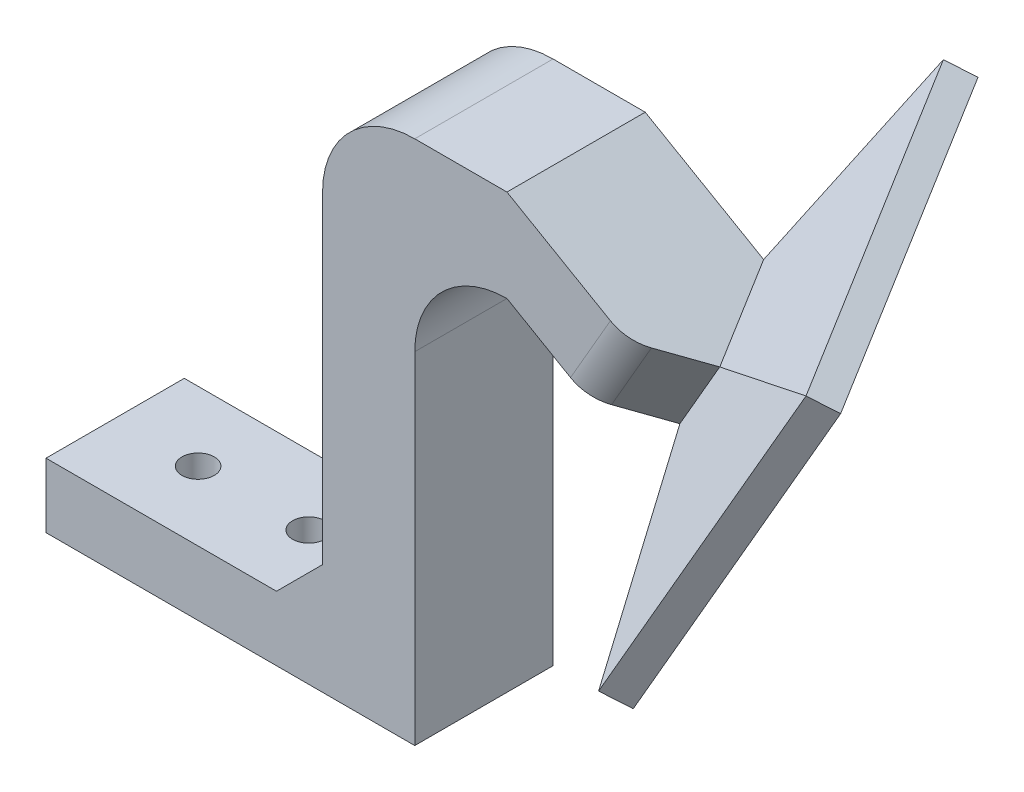
ISO-10303-21;
HEADER;
FILE_DESCRIPTION(('STEP AP214'),'2;1');
FILE_NAME('part.step','',(''),(''),'','','');
FILE_SCHEMA(('AUTOMOTIVE_DESIGN { 1 0 10303 214 1 1 1 1 }'));
ENDSEC;
DATA;
#1=APPLICATION_CONTEXT('core data for automotive mechanical design processes');
#2=APPLICATION_PROTOCOL_DEFINITION('international standard','automotive_design',2000,#1);
#3=PRODUCT_CONTEXT('',#1,'mechanical');
#4=PRODUCT('Part','Part','',(#3));
#5=PRODUCT_RELATED_PRODUCT_CATEGORY('part','',(#4));
#6=PRODUCT_DEFINITION_FORMATION('','',#4);
#7=PRODUCT_DEFINITION_CONTEXT('part definition',#1,'design');
#8=PRODUCT_DEFINITION('design','',#6,#7);
#9=PRODUCT_DEFINITION_SHAPE('','',#8);
#10=(LENGTH_UNIT() NAMED_UNIT(*) SI_UNIT(.MILLI.,.METRE.));
#11=(NAMED_UNIT(*) PLANE_ANGLE_UNIT() SI_UNIT($,.RADIAN.));
#12=(NAMED_UNIT(*) SI_UNIT($,.STERADIAN.) SOLID_ANGLE_UNIT());
#13=UNCERTAINTY_MEASURE_WITH_UNIT(LENGTH_MEASURE(1.E-05),#10,'distance_accuracy_value','');
#14=(GEOMETRIC_REPRESENTATION_CONTEXT(3) GLOBAL_UNCERTAINTY_ASSIGNED_CONTEXT((#13)) GLOBAL_UNIT_ASSIGNED_CONTEXT((#10,
#11,#12)) REPRESENTATION_CONTEXT('',''));
#15=CARTESIAN_POINT('',(0.,0.,0.));
#16=DIRECTION('',(0.,0.,1.));
#17=DIRECTION('',(1.,0.,0.));
#18=AXIS2_PLACEMENT_3D('',#15,#16,#17);
#19=CARTESIAN_POINT('',(2.07514390191196,8.68866645557202,2.5));
#20=DIRECTION('',(-0.499999999999998,-0.86602540378444,0.));
#21=DIRECTION('',(0.86602540378444,-0.499999999999998,0.));
#22=AXIS2_PLACEMENT_3D('',#19,#20,#21);
#23=CYLINDRICAL_SURFACE('',#22,5.);
#24=DIRECTION('',(0.499999999999998,0.86602540378444,0.));
#25=VECTOR('',#24,1.);
#26=CARTESIAN_POINT('',(2.07514390191196,8.68866645557202,7.5));
#27=LINE('',#26,#25);
#28=CARTESIAN_POINT('',(21.8957531153131,43.0189686501509,7.5));
#29=VERTEX_POINT('',#28);
#30=CARTESIAN_POINT('',(26.2257789965232,50.5187934744943,7.49999999999965));
#31=VERTEX_POINT('',#30);
#32=EDGE_CURVE('E334',#29,#31,#27,.T.);
#33=ORIENTED_EDGE('',*,*,#32,.F.);
#34=CARTESIAN_POINT('',(21.8957531153131,43.0189686501508,2.5));
#35=DIRECTION('',(-0.499977999515988,-0.866038105397211,0.));
#36=DIRECTION('',(-0.866038105397211,0.499977999515988,-2.34568710330772E-10));
#37=AXIS2_PLACEMENT_3D('',#34,#35,#36);
#38=ELLIPSE('',#37,5.00000000161338,5.);
#39=CARTESIAN_POINT('',(23.6603810567667,42.0002200032269,7.06598723446655));
#40=VERTEX_POINT('',#39);
#41=EDGE_CURVE('E50',#40,#29,#38,.T.);
#42=ORIENTED_EDGE('',*,*,#41,.F.);
#43=CARTESIAN_POINT('',(21.8957789965229,43.0190134777212,2.5));
#44=DIRECTION('',(0.499999999999997,0.86602540378444,0.));
#45=DIRECTION('',(-0.86602540378444,0.499999999999997,0.));
#46=AXIS2_PLACEMENT_3D('',#43,#44,#45);
#47=CIRCLE('',#46,5.);
#48=CARTESIAN_POINT('',(24.9223578813942,41.2716173438171,6.07581137713784));
#49=VERTEX_POINT('',#48);
#50=EDGE_CURVE('E60',#49,#40,#47,.F.);
#51=ORIENTED_EDGE('',*,*,#50,.F.);
#52=DIRECTION('',(0.499999999999998,0.86602540378444,0.));
#53=VECTOR('',#52,1.);
#54=CARTESIAN_POINT('',(5.10172278678324,6.94127032166796,6.07581137713784));
#55=LINE('',#54,#53);
#56=CARTESIAN_POINT('',(29.2523578813942,48.7713973405903,6.07581137713784));
#57=VERTEX_POINT('',#56);
#58=EDGE_CURVE('E337',#57,#49,#55,.F.);
#59=ORIENTED_EDGE('',*,*,#58,.F.);
#60=CARTESIAN_POINT('',(26.2257789965229,50.5187934744944,2.5));
#61=DIRECTION('',(0.499999999999997,0.86602540378444,0.));
#62=DIRECTION('',(-0.86602540378444,0.499999999999997,0.));
#63=AXIS2_PLACEMENT_3D('',#60,#61,#62);
#64=CIRCLE('',#63,5.);
#65=EDGE_CURVE('E11',#31,#57,#64,.T.);
#66=ORIENTED_EDGE('',*,*,#65,.F.);
#67=EDGE_LOOP('',(#33,#42,#51,#59,#66));
#68=FACE_BOUND('',#67,.T.);
#69=ADVANCED_FACE('F43',(#68),#23,.T.);
#70=CARTESIAN_POINT('',(35.4225012830392,66.1898988334547,-19.415539839597));
#71=DIRECTION('',(-0.604774506545182,0.627686202271237,0.49016102222774));
#72=DIRECTION('',(-0.720127614596302,-0.693841638052834,0.));
#73=AXIS2_PLACEMENT_3D('',#70,#71,#72);
#74=PLANE('',#73);
#75=DIRECTION('',(0.437406678817951,-0.252536863692347,0.863076201619465));
#76=VECTOR('',#75,1.);
#77=CARTESIAN_POINT('',(35.4225012830392,66.1898988334547,-19.415539839597));
#78=LINE('',#77,#76);
#79=CARTESIAN_POINT('',(35.4225012830392,66.1898988334547,-19.415539839597));
#80=VERTEX_POINT('',#79);
#81=CARTESIAN_POINT('',(50.7317350623268,57.3511086270808,10.7921272133025));
#82=VERTEX_POINT('',#81);
#83=EDGE_CURVE('E232',#80,#82,#78,.T.);
#84=ORIENTED_EDGE('',*,*,#83,.F.);
#85=DIRECTION('',(-0.347628224430399,-0.761805340038651,0.546632638494962));
#86=VECTOR('',#85,1.);
#87=CARTESIAN_POINT('',(35.4225012830393,66.1898988334547,-19.415539839597));
#88=LINE('',#87,#86);
#89=CARTESIAN_POINT('',(27.8448748003715,49.5840080755326,-7.50000000000034));
#90=VERTEX_POINT('',#89);
#91=EDGE_CURVE('E202',#80,#90,#88,.T.);
#92=ORIENTED_EDGE('',*,*,#91,.T.);
#93=DIRECTION('',(0.437406678817952,-0.252536863692347,0.863076201619464));
#94=VECTOR('',#93,1.);
#95=CARTESIAN_POINT('',(22.9620541790518,52.4031058748911,-17.1346180316308));
#96=LINE('',#95,#94);
#97=CARTESIAN_POINT('',(32.7338673059775,46.761346937121,2.14679618754349));
#98=VERTEX_POINT('',#97);
#99=EDGE_CURVE('E454',#90,#98,#96,.T.);
#100=ORIENTED_EDGE('',*,*,#99,.T.);
#101=DIRECTION('',(0.796328377233726,0.468551489219258,0.382518780666669));
#102=VECTOR('',#101,1.);
#103=CARTESIAN_POINT('',(35.1199171481488,48.165274312701,3.29294255123355));
#104=LINE('',#103,#102);
#105=EDGE_CURVE('E241',#98,#82,#104,.T.);
#106=ORIENTED_EDGE('',*,*,#105,.T.);
#107=EDGE_LOOP('',(#84,#92,#100,#106));
#108=FACE_BOUND('',#107,.T.);
#109=ADVANCED_FACE('F239',(#108),#74,.T.);
#110=CARTESIAN_POINT('',(12.9225012842076,27.2187556624804,-19.4155398372918));
#111=DIRECTION('',(-0.845978951021959,0.209908530706382,0.490161221604152));
#112=DIRECTION('',(0.501330346315729,0.,0.865255964361386));
#113=AXIS2_PLACEMENT_3D('',#110,#111,#112);
#114=PLANE('',#113);
#115=DIRECTION('',(0.437406678817952,-0.252536863692347,0.863076201619464));
#116=VECTOR('',#115,1.);
#117=CARTESIAN_POINT('',(18.6320541792767,44.903325877988,-17.1346180311871));
#118=LINE('',#117,#116);
#119=CARTESIAN_POINT('',(23.5148750717056,42.0842279221045,-7.49999946428666));
#120=VERTEX_POINT('',#119);
#121=CARTESIAN_POINT('',(23.6603810565644,42.0002200026004,-7.21289193071119));
#122=VERTEX_POINT('',#121);
#123=EDGE_CURVE('E472',#120,#122,#118,.T.);
#124=ORIENTED_EDGE('',*,*,#123,.F.);
#125=DIRECTION('',(-0.485929218390673,-0.68195927708417,-0.546629983730372));
#126=VECTOR('',#125,1.);
#127=CARTESIAN_POINT('',(12.9225012807178,27.2187556736181,-19.4155398480847));
#128=LINE('',#127,#126);
#129=CARTESIAN_POINT('',(12.9225012842076,27.2187556754048,-19.4155398335101));
#130=VERTEX_POINT('',#129);
#131=EDGE_CURVE('E225',#120,#130,#128,.T.);
#132=ORIENTED_EDGE('',*,*,#131,.T.);
#133=DIRECTION('',(-0.437406678817952,0.252536863692347,-0.863076201619464));
#134=VECTOR('',#133,1.);
#135=CARTESIAN_POINT('',(12.9225012842076,27.2187556624803,-19.4155398372918));
#136=LINE('',#135,#134);
#137=CARTESIAN_POINT('',(28.2317350428359,18.3799654332482,10.7921272193894));
#138=VERTEX_POINT('',#137);
#139=EDGE_CURVE('E243',#138,#130,#136,.T.);
#140=ORIENTED_EDGE('',*,*,#139,.F.);
#141=DIRECTION('',(0.00761607921933486,0.923917041478053,-0.382517052958121));
#142=VECTOR('',#141,1.);
#143=CARTESIAN_POINT('',(28.3810456892135,36.493045233171,3.2930103138525));
#144=LINE('',#143,#142);
#145=CARTESIAN_POINT('',(28.4038673059775,39.2615669403477,2.14679618754343));
#146=VERTEX_POINT('',#145);
#147=EDGE_CURVE('E212',#138,#146,#144,.T.);
#148=ORIENTED_EDGE('',*,*,#147,.T.);
#149=EDGE_CURVE('E478',#122,#146,#118,.T.);
#150=ORIENTED_EDGE('',*,*,#149,.F.);
#151=EDGE_LOOP('',(#124,#132,#140,#148,#150));
#152=FACE_BOUND('',#151,.T.);
#153=ADVANCED_FACE('F471',(#152),#114,.T.);
#154=CARTESIAN_POINT('',(37.664839031052,64.8952845310255,-20.9307610220595));
#155=DIRECTION('',(0.437406678817952,-0.252536863692347,0.863076201619464));
#156=DIRECTION('',(0.891987963218829,0.,-0.452059148201565));
#157=AXIS2_PLACEMENT_3D('',#154,#155,#156);
#158=PLANE('',#157);
#159=DIRECTION('',(-0.500000000098402,-0.866025403727626,1.35264641749305E-10));
#160=VECTOR('',#159,1.);
#161=CARTESIAN_POINT('',(39.5075330380544,73.2653813818165,-19.4155398407022));
#162=LINE('',#161,#160);
#163=CARTESIAN_POINT('',(26.3375330382892,50.4542722483976,-19.415539839597));
#164=VERTEX_POINT('',#163);
#165=EDGE_CURVE('E205',#80,#164,#162,.T.);
#166=ORIENTED_EDGE('',*,*,#165,.F.);
#167=DIRECTION('',(-0.747445916004237,0.43153810080973,0.5050737274875));
#168=VECTOR('',#167,1.);
#169=CARTESIAN_POINT('',(37.664839031052,64.8952845310255,-20.9307610220595));
#170=LINE('',#169,#168);
#171=CARTESIAN_POINT('',(37.664839031052,64.8952845310255,-20.9307610220595));
#172=VERTEX_POINT('',#171);
#173=EDGE_CURVE('E220',#172,#80,#170,.T.);
#174=ORIENTED_EDGE('',*,*,#173,.F.);
#175=DIRECTION('',(0.499999999974035,0.866025403799429,-5.12271552338067E-11));
#176=VECTOR('',#175,1.);
#177=CARTESIAN_POINT('',(37.664839031052,64.8952845310255,-20.9307610220595));
#178=LINE('',#177,#176);
#179=CARTESIAN_POINT('',(15.1648390322204,25.9241413600512,-20.9307610197543));
#180=VERTEX_POINT('',#179);
#181=EDGE_CURVE('E371',#180,#172,#178,.T.);
#182=ORIENTED_EDGE('',*,*,#181,.F.);
#183=DIRECTION('',(-0.747445916004237,0.43153810080973,0.5050737274875));
#184=VECTOR('',#183,1.);
#185=CARTESIAN_POINT('',(15.1648390322204,25.9241413600512,-20.9307610197543));
#186=LINE('',#185,#184);
#187=EDGE_CURVE('E235',#180,#130,#186,.T.);
#188=ORIENTED_EDGE('',*,*,#187,.T.);
#189=CARTESIAN_POINT('',(22.0075330346103,42.9544922513496,-19.4155398359679));
#190=VERTEX_POINT('',#189);
#191=EDGE_CURVE('E226',#190,#130,#162,.T.);
#192=ORIENTED_EDGE('',*,*,#191,.F.);
#193=DIRECTION('',(0.499999999999998,0.86602540378444,0.));
#194=VECTOR('',#193,1.);
#195=CARTESIAN_POINT('',(22.0075330382892,42.9544922516244,-19.415539839597));
#196=LINE('',#195,#194);
#197=EDGE_CURVE('E224',#190,#164,#196,.T.);
#198=ORIENTED_EDGE('',*,*,#197,.T.);
#199=EDGE_LOOP('',(#166,#174,#182,#188,#192,#198));
#200=FACE_BOUND('',#199,.T.);
#201=ADVANCED_FACE('F218',(#200),#158,.F.);
#202=CARTESIAN_POINT('',(22.9620541790518,52.4031058748911,-17.1346180316308));
#203=DIRECTION('',(-0.500000000098402,-0.866025403727626,1.35265261293403E-10));
#204=DIRECTION('',(0.866025403727626,-0.500000000098402,0.));
#205=AXIS2_PLACEMENT_3D('',#202,#203,#204);
#206=PLANE('',#205);
#207=DIRECTION('',(0.866025403727626,-0.500000000098402,0.));
#208=VECTOR('',#207,1.);
#209=CARTESIAN_POINT('',(29.1506350989466,48.8301270154553,-7.5));
#210=LINE('',#209,#208);
#211=CARTESIAN_POINT('',(27.9903810567666,49.5000000000001,-7.50000000000034));
#212=VERTEX_POINT('',#211);
#213=EDGE_CURVE('E450',#90,#212,#210,.T.);
#214=ORIENTED_EDGE('',*,*,#213,.F.);
#215=DIRECTION('',(-0.125173807399672,0.0722691312621042,-0.989499212029848));
#216=VECTOR('',#215,1.);
#217=CARTESIAN_POINT('',(26.5495284315857,50.3318766488418,-17.7397157827659));
#218=LINE('',#217,#216);
#219=EDGE_CURVE('E207',#90,#164,#218,.T.);
#220=ORIENTED_EDGE('',*,*,#219,.T.);
#221=DIRECTION('',(0.136967801126836,-0.0790783968508894,0.987414010740162));
#222=VECTOR('',#221,1.);
#223=CARTESIAN_POINT('',(26.3375330382892,50.4542722483976,-19.415539839597));
#224=LINE('',#223,#222);
#225=EDGE_CURVE('E397',#164,#212,#224,.T.);
#226=ORIENTED_EDGE('',*,*,#225,.T.);
#227=EDGE_LOOP('',(#214,#220,#226));
#228=FACE_BOUND('',#227,.T.);
#229=ADVANCED_FACE('F491',(#228),#206,.T.);
#230=CARTESIAN_POINT('',(18.6320541792767,44.903325877988,-17.1346180311871));
#231=DIRECTION('',(0.500000000098401,0.866025403727627,-1.35264616967541E-10));
#232=DIRECTION('',(-0.866025403727627,0.500000000098401,0.));
#233=AXIS2_PLACEMENT_3D('',#230,#231,#232);
#234=PLANE('',#233);
#235=DIRECTION('',(0.136967801126836,-0.0790783968508894,0.987414010740162));
#236=VECTOR('',#235,1.);
#237=CARTESIAN_POINT('',(22.0075330382892,42.9544922516244,-19.415539839597));
#238=LINE('',#237,#236);
#239=CARTESIAN_POINT('',(23.6603810564254,42.0002200026358,-7.50000000000035));
#240=VERTEX_POINT('',#239);
#241=EDGE_CURVE('E389',#190,#240,#238,.T.);
#242=ORIENTED_EDGE('',*,*,#241,.F.);
#243=DIRECTION('',(0.125173807399672,-0.0722691312621047,0.989499212029848));
#244=VECTOR('',#243,1.);
#245=CARTESIAN_POINT('',(22.2195284306659,42.8320966525996,-17.7397157821292));
#246=LINE('',#245,#244);
#247=EDGE_CURVE('E331',#190,#120,#246,.T.);
#248=ORIENTED_EDGE('',*,*,#247,.T.);
#249=DIRECTION('',(-0.866025403727627,0.500000000098401,0.));
#250=VECTOR('',#249,1.);
#251=CARTESIAN_POINT('',(24.8206350980944,41.3303470191741,-7.5));
#252=LINE('',#251,#250);
#253=CARTESIAN_POINT('',(23.6603577906886,42.0002334351152,-7.5));
#254=VERTEX_POINT('',#253);
#255=EDGE_CURVE('E480',#254,#120,#252,.T.);
#256=ORIENTED_EDGE('',*,*,#255,.F.);
#257=DIRECTION('',(-0.866038105397211,0.499977999515988,0.));
#258=VECTOR('',#257,1.);
#259=CARTESIAN_POINT('',(15.,47.,-7.50000000000033));
#260=LINE('',#259,#258);
#261=EDGE_CURVE('E393',#240,#254,#260,.T.);
#262=ORIENTED_EDGE('',*,*,#261,.F.);
#263=EDGE_LOOP('',(#242,#248,#256,#262));
#264=FACE_BOUND('',#263,.T.);
#265=ADVANCED_FACE('F390',(#264),#234,.T.);
#266=CARTESIAN_POINT('',(52.9740727896803,56.0564943017933,9.27690603462174));
#267=DIRECTION('',(-0.437406678817951,0.252536863692347,-0.863076201619464));
#268=DIRECTION('',(-0.891987963218829,0.,0.452059148201565));
#269=AXIS2_PLACEMENT_3D('',#266,#267,#268);
#270=PLANE('',#269);
#271=DIRECTION('',(0.499999999999998,0.86602540378444,0.));
#272=VECTOR('',#271,1.);
#273=CARTESIAN_POINT('',(37.3167667958788,34.1157020205931,10.7921272170842));
#274=LINE('',#273,#272);
#275=EDGE_CURVE('E378',#138,#82,#274,.T.);
#276=ORIENTED_EDGE('',*,*,#275,.F.);
#277=DIRECTION('',(-0.747445916004237,0.43153810080973,0.5050737274875));
#278=VECTOR('',#277,1.);
#279=CARTESIAN_POINT('',(30.4740727908487,17.085351130819,9.27690603692693));
#280=LINE('',#279,#278);
#281=CARTESIAN_POINT('',(30.4740727908487,17.085351130819,9.27690603692693));
#282=VERTEX_POINT('',#281);
#283=EDGE_CURVE('E256',#282,#138,#280,.T.);
#284=ORIENTED_EDGE('',*,*,#283,.F.);
#285=DIRECTION('',(-0.499999999974036,-0.866025403799429,5.12266540914692E-11));
#286=VECTOR('',#285,1.);
#287=CARTESIAN_POINT('',(52.9740727896803,56.0564943017933,9.27690603462174));
#288=LINE('',#287,#286);
#289=CARTESIAN_POINT('',(52.9740727896803,56.0564943017933,9.27690603462174));
#290=VERTEX_POINT('',#289);
#291=EDGE_CURVE('E242',#290,#282,#288,.T.);
#292=ORIENTED_EDGE('',*,*,#291,.F.);
#293=DIRECTION('',(-0.747445916004237,0.43153810080973,0.5050737274875));
#294=VECTOR('',#293,1.);
#295=CARTESIAN_POINT('',(52.9740727896803,56.0564943017933,9.27690603462174));
#296=LINE('',#295,#294);
#297=EDGE_CURVE('E236',#290,#82,#296,.T.);
#298=ORIENTED_EDGE('',*,*,#297,.T.);
#299=EDGE_LOOP('',(#276,#284,#292,#298));
#300=FACE_BOUND('',#299,.T.);
#301=ADVANCED_FACE('F377',(#300),#270,.F.);
#302=CARTESIAN_POINT('',(15.,37.,-3.));
#303=DIRECTION('',(0.,0.,-1.));
#304=DIRECTION('',(-1.,0.,0.));
#305=AXIS2_PLACEMENT_3D('',#302,#303,#304);
#306=CYLINDRICAL_SURFACE('',#305,10.);
#307=DIRECTION('',(0.,0.,1.));
#308=VECTOR('',#307,1.);
#309=CARTESIAN_POINT('',(15.,47.,-3.));
#310=LINE('',#309,#308);
#311=CARTESIAN_POINT('',(15.,47.,-3.));
#312=VERTEX_POINT('',#311);
#313=CARTESIAN_POINT('',(15.,47.0000000000001,3.));
#314=VERTEX_POINT('',#313);
#315=EDGE_CURVE('E282',#312,#314,#310,.T.);
#316=ORIENTED_EDGE('',*,*,#315,.T.);
#317=DIRECTION('',(0.,0.,-1.));
#318=VECTOR('',#317,1.);
#319=CARTESIAN_POINT('',(15.,47.0000000000001,7.49999999999967));
#320=LINE('',#319,#318);
#321=CARTESIAN_POINT('',(15.,47.0000000000001,7.49999999999967));
#322=VERTEX_POINT('',#321);
#323=EDGE_CURVE('E362',#322,#314,#320,.T.);
#324=ORIENTED_EDGE('',*,*,#323,.F.);
#325=CARTESIAN_POINT('',(15.,37.,7.5));
#326=DIRECTION('',(0.,0.,-1.));
#327=DIRECTION('',(-1.,0.,0.));
#328=AXIS2_PLACEMENT_3D('',#325,#326,#327);
#329=CIRCLE('',#328,10.);
#330=CARTESIAN_POINT('',(4.99999999999998,37.,7.5));
#331=VERTEX_POINT('',#330);
#332=EDGE_CURVE('E326',#322,#331,#329,.F.);
#333=ORIENTED_EDGE('',*,*,#332,.T.);
#334=DIRECTION('',(0.,0.,-1.));
#335=VECTOR('',#334,1.);
#336=CARTESIAN_POINT('',(4.99999999999998,37.,-7.5));
#337=LINE('',#336,#335);
#338=CARTESIAN_POINT('',(4.99999999999998,37.,-7.5));
#339=VERTEX_POINT('',#338);
#340=EDGE_CURVE('E319',#339,#331,#337,.F.);
#341=ORIENTED_EDGE('',*,*,#340,.F.);
#342=CARTESIAN_POINT('',(15.,37.,-7.5));
#343=DIRECTION('',(0.,0.,1.));
#344=DIRECTION('',(1.,0.,0.));
#345=AXIS2_PLACEMENT_3D('',#342,#343,#344);
#346=CIRCLE('',#345,10.);
#347=CARTESIAN_POINT('',(15.,47.,-7.50000000000033));
#348=VERTEX_POINT('',#347);
#349=EDGE_CURVE('E328',#339,#348,#346,.F.);
#350=ORIENTED_EDGE('',*,*,#349,.T.);
#351=EDGE_CURVE('E364',#312,#348,#320,.T.);
#352=ORIENTED_EDGE('',*,*,#351,.F.);
#353=EDGE_LOOP('',(#316,#324,#333,#341,#350,#352));
#354=FACE_BOUND('',#353,.T.);
#355=ADVANCED_FACE('F535',(#354),#306,.F.);
#356=CARTESIAN_POINT('',(-0.441342951089774,0.254809471616621,0.));
#357=DIRECTION('',(-0.86602540378444,0.499999999999997,0.));
#358=DIRECTION('',(-0.499999999999997,-0.86602540378444,0.));
#359=AXIS2_PLACEMENT_3D('',#356,#357,#358);
#360=PLANE('',#359);
#361=DIRECTION('',(0.,0.,1.));
#362=VECTOR('',#361,1.);
#363=CARTESIAN_POINT('',(23.6603810567667,42.0002200032269,-3.));
#364=LINE('',#363,#362);
#365=CARTESIAN_POINT('',(23.6603810567667,42.0002200032269,-3.));
#366=VERTEX_POINT('',#365);
#367=CARTESIAN_POINT('',(23.6603810567666,42.0002200032269,3.00000000000003));
#368=VERTEX_POINT('',#367);
#369=EDGE_CURVE('E259',#366,#368,#364,.T.);
#370=ORIENTED_EDGE('',*,*,#369,.T.);
#371=DIRECTION('',(-0.499999999999997,-0.86602540378444,0.));
#372=VECTOR('',#371,1.);
#373=CARTESIAN_POINT('',(23.6602540378444,42.0000000000001,3.));
#374=LINE('',#373,#372);
#375=CARTESIAN_POINT('',(23.6602540378444,42.0000000000001,3.));
#376=VERTEX_POINT('',#375);
#377=EDGE_CURVE('E262',#368,#376,#374,.T.);
#378=ORIENTED_EDGE('',*,*,#377,.T.);
#379=DIRECTION('',(0.,0.,-1.));
#380=VECTOR('',#379,1.);
#381=CARTESIAN_POINT('',(23.6602540378444,42.0000000000001,-3.));
#382=LINE('',#381,#380);
#383=CARTESIAN_POINT('',(23.6602540378444,42.0000000000001,-3.));
#384=VERTEX_POINT('',#383);
#385=EDGE_CURVE('E264',#376,#384,#382,.T.);
#386=ORIENTED_EDGE('',*,*,#385,.T.);
#387=DIRECTION('',(0.499999999999997,0.86602540378444,0.));
#388=VECTOR('',#387,1.);
#389=CARTESIAN_POINT('',(27.9903810567666,49.5000000000001,-3.));
#390=LINE('',#389,#388);
#391=EDGE_CURVE('E266',#384,#366,#390,.T.);
#392=ORIENTED_EDGE('',*,*,#391,.T.);
#393=EDGE_LOOP('',(#370,#378,#386,#392));
#394=FACE_BOUND('',#393,.T.);
#395=ADVANCED_FACE('F540',(#394),#360,.F.);
#396=CARTESIAN_POINT('',(5.,47.,-3.4567868693236E-13));
#397=DIRECTION('',(0.,0.,-1.));
#398=DIRECTION('',(0.,1.,0.));
#399=AXIS2_PLACEMENT_3D('',#396,#397,#398);
#400=CYLINDRICAL_SURFACE('',#399,10.);
#401=DIRECTION('',(0.,0.,1.));
#402=VECTOR('',#401,1.);
#403=CARTESIAN_POINT('',(5.,57.,-4.15067625971432E-13));
#404=LINE('',#403,#402);
#405=CARTESIAN_POINT('',(4.99999999999999,57.,-7.5000000000004));
#406=VERTEX_POINT('',#405);
#407=CARTESIAN_POINT('',(4.99999999999999,57.0000000000001,7.4999999999996));
#408=VERTEX_POINT('',#407);
#409=EDGE_CURVE('E314',#406,#408,#404,.T.);
#410=ORIENTED_EDGE('',*,*,#409,.F.);
#411=CARTESIAN_POINT('',(4.99999999999999,47.,-7.50000000000033));
#412=DIRECTION('',(0.,0.,-1.));
#413=DIRECTION('',(0.,1.,0.));
#414=AXIS2_PLACEMENT_3D('',#411,#412,#413);
#415=CIRCLE('',#414,10.);
#416=CARTESIAN_POINT('',(-5.00000000000002,47.,-7.50000000000033));
#417=VERTEX_POINT('',#416);
#418=EDGE_CURVE('E411',#417,#406,#415,.T.);
#419=ORIENTED_EDGE('',*,*,#418,.F.);
#420=DIRECTION('',(0.,0.,1.));
#421=VECTOR('',#420,1.);
#422=CARTESIAN_POINT('',(-5.,47.,-3.10984217412824E-13));
#423=LINE('',#422,#421);
#424=CARTESIAN_POINT('',(-5.00000000000002,47.0000000000001,7.49999999999967));
#425=VERTEX_POINT('',#424);
#426=EDGE_CURVE('E316',#425,#417,#423,.F.);
#427=ORIENTED_EDGE('',*,*,#426,.F.);
#428=CARTESIAN_POINT('',(4.99999999999999,47.0000000000001,7.49999999999967));
#429=DIRECTION('',(0.,0.,-1.));
#430=DIRECTION('',(0.,1.,0.));
#431=AXIS2_PLACEMENT_3D('',#428,#429,#430);
#432=CIRCLE('',#431,10.);
#433=EDGE_CURVE('E426',#425,#408,#432,.T.);
#434=ORIENTED_EDGE('',*,*,#433,.T.);
#435=EDGE_LOOP('',(#410,#419,#427,#434));
#436=FACE_BOUND('',#435,.T.);
#437=ADVANCED_FACE('F436',(#436),#400,.T.);
#438=CARTESIAN_POINT('',(4.99999999999998,7.,7.5));
#439=DIRECTION('',(0.,0.,-1.));
#440=DIRECTION('',(-1.,0.,0.));
#441=AXIS2_PLACEMENT_3D('',#438,#439,#440);
#442=PLANE('',#441);
#443=DIRECTION('',(-0.866038105397211,0.499977999515988,0.));
#444=VECTOR('',#443,1.);
#445=CARTESIAN_POINT('',(15.,47.0000000000001,7.49999999999967));
#446=LINE('',#445,#444);
#447=EDGE_CURVE('E343',#29,#322,#446,.T.);
#448=ORIENTED_EDGE('',*,*,#447,.F.);
#449=ORIENTED_EDGE('',*,*,#32,.T.);
#450=DIRECTION('',(0.866025403784441,-0.499999999999997,0.));
#451=VECTOR('',#450,1.);
#452=CARTESIAN_POINT('',(27.9903810567666,49.5000000000002,7.49999999999965));
#453=LINE('',#452,#451);
#454=CARTESIAN_POINT('',(15.,57.0000000000001,7.4999999999996));
#455=VERTEX_POINT('',#454);
#456=EDGE_CURVE('E354',#455,#31,#453,.T.);
#457=ORIENTED_EDGE('',*,*,#456,.F.);
#458=DIRECTION('',(1.,0.,0.));
#459=VECTOR('',#458,1.);
#460=CARTESIAN_POINT('',(4.99999999999999,57.0000000000001,7.4999999999996));
#461=LINE('',#460,#459);
#462=EDGE_CURVE('E358',#408,#455,#461,.T.);
#463=ORIENTED_EDGE('',*,*,#462,.F.);
#464=ORIENTED_EDGE('',*,*,#433,.F.);
#465=DIRECTION('',(0.,1.,0.));
#466=VECTOR('',#465,1.);
#467=CARTESIAN_POINT('',(-5.00000000000001,7.00000000000008,7.49999999999995));
#468=LINE('',#467,#466);
#469=CARTESIAN_POINT('',(-5.00000000000001,12.0000000000001,7.5));
#470=VERTEX_POINT('',#469);
#471=EDGE_CURVE('E424',#470,#425,#468,.T.);
#472=ORIENTED_EDGE('',*,*,#471,.F.);
#473=DIRECTION('',(-0.707106781186542,-0.707106781186553,0.));
#474=VECTOR('',#473,1.);
#475=CARTESIAN_POINT('',(-5.00000000000001,12.0000000000001,7.5));
#476=LINE('',#475,#474);
#477=CARTESIAN_POINT('',(-10.,7.,7.5));
#478=VERTEX_POINT('',#477);
#479=EDGE_CURVE('E446',#470,#478,#476,.T.);
#480=ORIENTED_EDGE('',*,*,#479,.T.);
#481=DIRECTION('',(1.,0.,0.));
#482=VECTOR('',#481,1.);
#483=CARTESIAN_POINT('',(4.99999999999998,7.,7.5));
#484=LINE('',#483,#482);
#485=CARTESIAN_POINT('',(-35.,7.,7.50000000000001));
#486=VERTEX_POINT('',#485);
#487=EDGE_CURVE('E289',#486,#478,#484,.T.);
#488=ORIENTED_EDGE('',*,*,#487,.F.);
#489=DIRECTION('',(0.,-1.,0.));
#490=VECTOR('',#489,1.);
#491=CARTESIAN_POINT('',(-35.,7.,7.50000000000001));
#492=LINE('',#491,#490);
#493=CARTESIAN_POINT('',(-35.,0.,7.50000000000001));
#494=VERTEX_POINT('',#493);
#495=EDGE_CURVE('E296',#486,#494,#492,.T.);
#496=ORIENTED_EDGE('',*,*,#495,.T.);
#497=DIRECTION('',(1.,0.,0.));
#498=VECTOR('',#497,1.);
#499=CARTESIAN_POINT('',(4.99999999999998,0.,7.5));
#500=LINE('',#499,#498);
#501=CARTESIAN_POINT('',(4.99999999999998,0.,7.5));
#502=VERTEX_POINT('',#501);
#503=EDGE_CURVE('E285',#494,#502,#500,.T.);
#504=ORIENTED_EDGE('',*,*,#503,.T.);
#505=DIRECTION('',(0.,-1.,0.));
#506=VECTOR('',#505,1.);
#507=CARTESIAN_POINT('',(4.99999999999998,7.,7.5));
#508=LINE('',#507,#506);
#509=EDGE_CURVE('E312',#331,#502,#508,.T.);
#510=ORIENTED_EDGE('',*,*,#509,.F.);
#511=ORIENTED_EDGE('',*,*,#332,.F.);
#512=EDGE_LOOP('',(#448,#449,#457,#463,#464,#472,#480,#488,#496,#504,#510,#511));
#513=FACE_BOUND('',#512,.T.);
#514=ADVANCED_FACE('F350',(#513),#442,.F.);
#515=CARTESIAN_POINT('',(4.99999999999998,7.,-7.5));
#516=DIRECTION('',(-1.,0.,0.));
#517=DIRECTION('',(0.,0.,1.));
#518=AXIS2_PLACEMENT_3D('',#515,#516,#517);
#519=PLANE('',#518);
#520=DIRECTION('',(0.,-1.,0.));
#521=VECTOR('',#520,1.);
#522=CARTESIAN_POINT('',(4.99999999999998,7.,-7.5));
#523=LINE('',#522,#521);
#524=CARTESIAN_POINT('',(4.99999999999998,0.,-7.5));
#525=VERTEX_POINT('',#524);
#526=EDGE_CURVE('E310',#339,#525,#523,.T.);
#527=ORIENTED_EDGE('',*,*,#526,.F.);
#528=ORIENTED_EDGE('',*,*,#340,.T.);
#529=ORIENTED_EDGE('',*,*,#509,.T.);
#530=DIRECTION('',(0.,0.,-1.));
#531=VECTOR('',#530,1.);
#532=CARTESIAN_POINT('',(4.99999999999998,0.,-7.5));
#533=LINE('',#532,#531);
#534=EDGE_CURVE('E299',#502,#525,#533,.T.);
#535=ORIENTED_EDGE('',*,*,#534,.T.);
#536=EDGE_LOOP('',(#527,#528,#529,#535));
#537=FACE_BOUND('',#536,.T.);
#538=ADVANCED_FACE('F583',(#537),#519,.F.);
#539=CARTESIAN_POINT('',(4.99999999999998,7.,-7.5));
#540=DIRECTION('',(0.,0.,1.));
#541=DIRECTION('',(1.,0.,0.));
#542=AXIS2_PLACEMENT_3D('',#539,#540,#541);
#543=PLANE('',#542);
#544=DIRECTION('',(0.866025403784441,-0.499999999999997,0.));
#545=VECTOR('',#544,1.);
#546=CARTESIAN_POINT('',(27.9903810567666,49.5000000000001,-7.50000000000034));
#547=LINE('',#546,#545);
#548=CARTESIAN_POINT('',(15.,57.,-7.5000000000004));
#549=VERTEX_POINT('',#548);
#550=EDGE_CURVE('E417',#549,#90,#547,.T.);
#551=ORIENTED_EDGE('',*,*,#550,.T.);
#552=ORIENTED_EDGE('',*,*,#213,.T.);
#553=DIRECTION('',(-0.499999999999997,-0.86602540378444,0.));
#554=VECTOR('',#553,1.);
#555=CARTESIAN_POINT('',(23.6603810567667,42.0002200032268,-7.50000000000029));
#556=LINE('',#555,#554);
#557=EDGE_CURVE('E420',#212,#240,#556,.T.);
#558=ORIENTED_EDGE('',*,*,#557,.T.);
#559=ORIENTED_EDGE('',*,*,#261,.T.);
#560=ORIENTED_EDGE('',*,*,#255,.T.);
#561=EDGE_CURVE('E422',#120,#348,#260,.T.);
#562=ORIENTED_EDGE('',*,*,#561,.T.);
#563=ORIENTED_EDGE('',*,*,#349,.F.);
#564=ORIENTED_EDGE('',*,*,#526,.T.);
#565=DIRECTION('',(-1.,0.,0.));
#566=VECTOR('',#565,1.);
#567=CARTESIAN_POINT('',(4.99999999999998,0.,-7.5));
#568=LINE('',#567,#566);
#569=CARTESIAN_POINT('',(-35.,0.,-7.49999999999999));
#570=VERTEX_POINT('',#569);
#571=EDGE_CURVE('E302',#525,#570,#568,.T.);
#572=ORIENTED_EDGE('',*,*,#571,.T.);
#573=DIRECTION('',(0.,-1.,0.));
#574=VECTOR('',#573,1.);
#575=CARTESIAN_POINT('',(-35.,7.,-7.49999999999999));
#576=LINE('',#575,#574);
#577=CARTESIAN_POINT('',(-35.,7.,-7.49999999999999));
#578=VERTEX_POINT('',#577);
#579=EDGE_CURVE('E307',#578,#570,#576,.T.);
#580=ORIENTED_EDGE('',*,*,#579,.F.);
#581=DIRECTION('',(-1.,0.,0.));
#582=VECTOR('',#581,1.);
#583=CARTESIAN_POINT('',(4.99999999999998,7.,-7.5));
#584=LINE('',#583,#582);
#585=CARTESIAN_POINT('',(-10.,7.,-7.5));
#586=VERTEX_POINT('',#585);
#587=EDGE_CURVE('E291',#586,#578,#584,.T.);
#588=ORIENTED_EDGE('',*,*,#587,.F.);
#589=DIRECTION('',(-0.707106781186542,-0.707106781186553,0.));
#590=VECTOR('',#589,1.);
#591=CARTESIAN_POINT('',(-5.00000000000001,12.0000000000001,-7.5));
#592=LINE('',#591,#590);
#593=CARTESIAN_POINT('',(-5.00000000000001,12.0000000000001,-7.50000000000008));
#594=VERTEX_POINT('',#593);
#595=EDGE_CURVE('E449',#594,#586,#592,.T.);
#596=ORIENTED_EDGE('',*,*,#595,.F.);
#597=DIRECTION('',(0.,1.,0.));
#598=VECTOR('',#597,1.);
#599=CARTESIAN_POINT('',(-5.00000000000001,6.99999999999997,-7.50000000000005));
#600=LINE('',#599,#598);
#601=EDGE_CURVE('E408',#594,#417,#600,.T.);
#602=ORIENTED_EDGE('',*,*,#601,.T.);
#603=ORIENTED_EDGE('',*,*,#418,.T.);
#604=DIRECTION('',(1.,0.,0.));
#605=VECTOR('',#604,1.);
#606=CARTESIAN_POINT('',(4.99999999999999,57.,-7.5000000000004));
#607=LINE('',#606,#605);
#608=EDGE_CURVE('E414',#406,#549,#607,.T.);
#609=ORIENTED_EDGE('',*,*,#608,.T.);
#610=EDGE_LOOP('',(#551,#552,#558,#559,#560,#562,#563,#564,#572,#580,#588,#596,#602,#603,#609));
#611=FACE_BOUND('',#610,.T.);
#612=ADVANCED_FACE('F489',(#611),#543,.F.);
#613=CARTESIAN_POINT('',(-35.,7.,-7.49999999999999));
#614=DIRECTION('',(1.,0.,0.));
#615=DIRECTION('',(0.,0.,-1.));
#616=AXIS2_PLACEMENT_3D('',#613,#614,#615);
#617=PLANE('',#616);
#618=DIRECTION('',(0.,0.,1.));
#619=VECTOR('',#618,1.);
#620=CARTESIAN_POINT('',(-35.,0.,-7.49999999999999));
#621=LINE('',#620,#619);
#622=EDGE_CURVE('E292',#570,#494,#621,.T.);
#623=ORIENTED_EDGE('',*,*,#622,.T.);
#624=ORIENTED_EDGE('',*,*,#495,.F.);
#625=DIRECTION('',(0.,0.,1.));
#626=VECTOR('',#625,1.);
#627=CARTESIAN_POINT('',(-35.,7.,-7.49999999999999));
#628=LINE('',#627,#626);
#629=EDGE_CURVE('E294',#578,#486,#628,.T.);
#630=ORIENTED_EDGE('',*,*,#629,.F.);
#631=ORIENTED_EDGE('',*,*,#579,.T.);
#632=EDGE_LOOP('',(#623,#624,#630,#631));
#633=FACE_BOUND('',#632,.T.);
#634=ADVANCED_FACE('F573',(#633),#617,.F.);
#635=CARTESIAN_POINT('',(0.,7.,0.));
#636=DIRECTION('',(0.,1.,0.));
#637=DIRECTION('',(0.,0.,1.));
#638=AXIS2_PLACEMENT_3D('',#635,#636,#637);
#639=PLANE('',#638);
#640=DIRECTION('',(0.,0.,1.));
#641=VECTOR('',#640,1.);
#642=CARTESIAN_POINT('',(-10.,7.,-7.5));
#643=LINE('',#642,#641);
#644=EDGE_CURVE('E457',#586,#478,#643,.T.);
#645=ORIENTED_EDGE('',*,*,#644,.F.);
#646=ORIENTED_EDGE('',*,*,#587,.T.);
#647=ORIENTED_EDGE('',*,*,#629,.T.);
#648=ORIENTED_EDGE('',*,*,#487,.T.);
#649=EDGE_LOOP('',(#645,#646,#647,#648));
#650=FACE_BOUND('',#649,.T.);
#651=CARTESIAN_POINT('',(-26.,7.00000000000002,0.));
#652=DIRECTION('',(0.,1.,0.));
#653=DIRECTION('',(0.,0.,1.));
#654=AXIS2_PLACEMENT_3D('',#651,#652,#653);
#655=CIRCLE('',#654,1.75);
#656=CARTESIAN_POINT('',(-26.,7.00000000000004,1.75000000000001));
#657=VERTEX_POINT('',#656);
#658=EDGE_CURVE('E276',#657,#657,#655,.T.);
#659=ORIENTED_EDGE('',*,*,#658,.F.);
#660=EDGE_LOOP('',(#659));
#661=FACE_BOUND('',#660,.T.);
#662=CARTESIAN_POINT('',(-14.,7.00000000000002,0.));
#663=DIRECTION('',(0.,1.,0.));
#664=DIRECTION('',(0.,0.,1.));
#665=AXIS2_PLACEMENT_3D('',#662,#663,#664);
#666=CIRCLE('',#665,1.75);
#667=CARTESIAN_POINT('',(-14.,7.00000000000004,1.75000000000001));
#668=VERTEX_POINT('',#667);
#669=EDGE_CURVE('E275',#668,#668,#666,.T.);
#670=ORIENTED_EDGE('',*,*,#669,.F.);
#671=EDGE_LOOP('',(#670));
#672=FACE_BOUND('',#671,.T.);
#673=ADVANCED_FACE('F570',(#650,#661,#672),#639,.T.);
#674=CARTESIAN_POINT('',(0.,0.,0.));
#675=DIRECTION('',(0.,1.,0.));
#676=DIRECTION('',(0.,0.,1.));
#677=AXIS2_PLACEMENT_3D('',#674,#675,#676);
#678=PLANE('',#677);
#679=CARTESIAN_POINT('',(-26.,0.,0.));
#680=DIRECTION('',(0.,1.,0.));
#681=DIRECTION('',(0.,0.,1.));
#682=AXIS2_PLACEMENT_3D('',#679,#680,#681);
#683=CIRCLE('',#682,1.75);
#684=CARTESIAN_POINT('',(-26.,0.,1.75000000000005));
#685=VERTEX_POINT('',#684);
#686=EDGE_CURVE('E288',#685,#685,#683,.T.);
#687=ORIENTED_EDGE('',*,*,#686,.T.);
#688=EDGE_LOOP('',(#687));
#689=FACE_BOUND('',#688,.T.);
#690=CARTESIAN_POINT('',(-14.,0.,0.));
#691=DIRECTION('',(0.,1.,0.));
#692=DIRECTION('',(0.,0.,1.));
#693=AXIS2_PLACEMENT_3D('',#690,#691,#692);
#694=CIRCLE('',#693,1.75);
#695=CARTESIAN_POINT('',(-14.,0.,1.75000000000005));
#696=VERTEX_POINT('',#695);
#697=EDGE_CURVE('E279',#696,#696,#694,.T.);
#698=ORIENTED_EDGE('',*,*,#697,.T.);
#699=EDGE_LOOP('',(#698));
#700=FACE_BOUND('',#699,.T.);
#701=ORIENTED_EDGE('',*,*,#503,.F.);
#702=ORIENTED_EDGE('',*,*,#622,.F.);
#703=ORIENTED_EDGE('',*,*,#571,.F.);
#704=ORIENTED_EDGE('',*,*,#534,.F.);
#705=EDGE_LOOP('',(#701,#702,#703,#704));
#706=FACE_BOUND('',#705,.T.);
#707=ADVANCED_FACE('F568',(#689,#700,#706),#678,.F.);
#708=CARTESIAN_POINT('',(-5.00000000000001,57.,-3.0000000000004));
#709=DIRECTION('',(0.,0.,1.));
#710=DIRECTION('',(0.,-1.,0.));
#711=AXIS2_PLACEMENT_3D('',#708,#709,#710);
#712=PLANE('',#711);
#713=DIRECTION('',(-0.86602540378444,0.499999999999997,0.));
#714=VECTOR('',#713,1.);
#715=CARTESIAN_POINT('',(23.6602540378444,42.0000000000001,-3.));
#716=LINE('',#715,#714);
#717=EDGE_CURVE('E269',#384,#312,#716,.T.);
#718=ORIENTED_EDGE('',*,*,#717,.T.);
#719=DIRECTION('',(0.866038105397211,-0.499977999515988,0.));
#720=VECTOR('',#719,1.);
#721=CARTESIAN_POINT('',(-4.33043999441093,58.1597799888224,-3.00000000000041));
#722=LINE('',#721,#720);
#723=EDGE_CURVE('E249',#312,#366,#722,.T.);
#724=ORIENTED_EDGE('',*,*,#723,.T.);
#725=ORIENTED_EDGE('',*,*,#391,.F.);
#726=EDGE_LOOP('',(#718,#724,#725));
#727=FACE_BOUND('',#726,.T.);
#728=ADVANCED_FACE('F565',(#727),#712,.F.);
#729=CARTESIAN_POINT('',(-4.99999999999999,57.,2.9999999999996));
#730=DIRECTION('',(1.,0.,0.));
#731=DIRECTION('',(0.,0.,-1.));
#732=AXIS2_PLACEMENT_3D('',#729,#730,#731);
#733=PLANE('',#732);
#734=ORIENTED_EDGE('',*,*,#601,.F.);
#735=DIRECTION('',(0.,0.,1.));
#736=VECTOR('',#735,1.);
#737=CARTESIAN_POINT('',(-5.00000000000001,12.0000000000001,-7.5));
#738=LINE('',#737,#736);
#739=EDGE_CURVE('E442',#594,#470,#738,.T.);
#740=ORIENTED_EDGE('',*,*,#739,.T.);
#741=ORIENTED_EDGE('',*,*,#471,.T.);
#742=ORIENTED_EDGE('',*,*,#426,.T.);
#743=EDGE_LOOP('',(#734,#740,#741,#742));
#744=FACE_BOUND('',#743,.T.);
#745=ADVANCED_FACE('F439',(#744),#733,.F.);
#746=CARTESIAN_POINT('',(-4.99999999999999,57.,2.9999999999996));
#747=DIRECTION('',(0.,0.,-1.));
#748=DIRECTION('',(0.,1.,0.));
#749=AXIS2_PLACEMENT_3D('',#746,#747,#748);
#750=PLANE('',#749);
#751=ORIENTED_EDGE('',*,*,#377,.F.);
#752=DIRECTION('',(-0.866038105397211,0.499977999515988,0.));
#753=VECTOR('',#752,1.);
#754=CARTESIAN_POINT('',(-4.33043999441091,58.1597799888225,2.99999999999959));
#755=LINE('',#754,#753);
#756=EDGE_CURVE('E363',#368,#314,#755,.T.);
#757=ORIENTED_EDGE('',*,*,#756,.T.);
#758=DIRECTION('',(-0.86602540378444,0.499999999999997,0.));
#759=VECTOR('',#758,1.);
#760=CARTESIAN_POINT('',(23.6602540378444,42.0000000000001,3.));
#761=LINE('',#760,#759);
#762=EDGE_CURVE('E272',#376,#314,#761,.T.);
#763=ORIENTED_EDGE('',*,*,#762,.F.);
#764=EDGE_LOOP('',(#751,#757,#763));
#765=FACE_BOUND('',#764,.T.);
#766=ADVANCED_FACE('F559',(#765),#750,.F.);
#767=CARTESIAN_POINT('',(0.,57.,-3.97720391211664E-13));
#768=DIRECTION('',(0.,1.,0.));
#769=DIRECTION('',(0.,0.,1.));
#770=AXIS2_PLACEMENT_3D('',#767,#768,#769);
#771=PLANE('',#770);
#772=DIRECTION('',(0.,0.,1.));
#773=VECTOR('',#772,1.);
#774=CARTESIAN_POINT('',(15.,57.,-3.));
#775=LINE('',#774,#773);
#776=EDGE_CURVE('E286',#549,#455,#775,.T.);
#777=ORIENTED_EDGE('',*,*,#776,.F.);
#778=ORIENTED_EDGE('',*,*,#608,.F.);
#779=ORIENTED_EDGE('',*,*,#409,.T.);
#780=ORIENTED_EDGE('',*,*,#462,.T.);
#781=EDGE_LOOP('',(#777,#778,#779,#780));
#782=FACE_BOUND('',#781,.T.);
#783=ADVANCED_FACE('F431',(#782),#771,.T.);
#784=CARTESIAN_POINT('',(15.,57.,-3.));
#785=DIRECTION('',(0.499999999999997,0.86602540378444,0.));
#786=DIRECTION('',(-0.86602540378444,0.499999999999997,0.));
#787=AXIS2_PLACEMENT_3D('',#784,#785,#786);
#788=PLANE('',#787);
#789=ORIENTED_EDGE('',*,*,#456,.T.);
#790=ORIENTED_EDGE('',*,*,#65,.T.);
#791=DIRECTION('',(0.619348698348559,-0.357581137713782,-0.698958453561628));
#792=VECTOR('',#791,1.);
#793=CARTESIAN_POINT('',(27.9903810567666,49.5000000000001,7.49999999999965));
#794=LINE('',#793,#792);
#795=EDGE_CURVE('E404',#57,#98,#794,.T.);
#796=ORIENTED_EDGE('',*,*,#795,.T.);
#797=ORIENTED_EDGE('',*,*,#99,.F.);
#798=ORIENTED_EDGE('',*,*,#550,.F.);
#799=ORIENTED_EDGE('',*,*,#776,.T.);
#800=EDGE_LOOP('',(#789,#790,#796,#797,#798,#799));
#801=FACE_BOUND('',#800,.T.);
#802=ADVANCED_FACE('F485',(#801),#788,.T.);
#803=CARTESIAN_POINT('',(-14.,-2.99999999999998,0.));
#804=DIRECTION('',(0.,1.,0.));
#805=DIRECTION('',(0.,0.,1.));
#806=AXIS2_PLACEMENT_3D('',#803,#804,#805);
#807=CYLINDRICAL_SURFACE('',#806,1.75);
#808=ORIENTED_EDGE('',*,*,#669,.T.);
#809=EDGE_LOOP('',(#808));
#810=FACE_BOUND('',#809,.T.);
#811=ORIENTED_EDGE('',*,*,#697,.F.);
#812=EDGE_LOOP('',(#811));
#813=FACE_BOUND('',#812,.T.);
#814=ADVANCED_FACE('F550',(#810,#813),#807,.F.);
#815=CARTESIAN_POINT('',(-26.,-2.99999999999998,0.));
#816=DIRECTION('',(0.,1.,0.));
#817=DIRECTION('',(0.,0.,1.));
#818=AXIS2_PLACEMENT_3D('',#815,#816,#817);
#819=CYLINDRICAL_SURFACE('',#818,1.75);
#820=ORIENTED_EDGE('',*,*,#658,.T.);
#821=EDGE_LOOP('',(#820));
#822=FACE_BOUND('',#821,.T.);
#823=ORIENTED_EDGE('',*,*,#686,.F.);
#824=EDGE_LOOP('',(#823));
#825=FACE_BOUND('',#824,.T.);
#826=ADVANCED_FACE('F546',(#822,#825),#819,.F.);
#827=CARTESIAN_POINT('',(23.6602540378444,42.0000000000001,-3.));
#828=DIRECTION('',(0.499999999999997,0.86602540378444,0.));
#829=DIRECTION('',(-0.86602540378444,0.499999999999997,0.));
#830=AXIS2_PLACEMENT_3D('',#827,#828,#829);
#831=PLANE('',#830);
#832=ORIENTED_EDGE('',*,*,#315,.F.);
#833=ORIENTED_EDGE('',*,*,#717,.F.);
#834=ORIENTED_EDGE('',*,*,#385,.F.);
#835=ORIENTED_EDGE('',*,*,#762,.T.);
#836=EDGE_LOOP('',(#832,#833,#834,#835));
#837=FACE_BOUND('',#836,.T.);
#838=ADVANCED_FACE('F538',(#837),#831,.F.);
#839=CARTESIAN_POINT('',(24.1017240078564,41.7454105316103,0.));
#840=DIRECTION('',(0.499999999999997,0.86602540378444,0.));
#841=DIRECTION('',(-0.86602540378444,0.499999999999997,0.));
#842=AXIS2_PLACEMENT_3D('',#839,#840,#841);
#843=PLANE('',#842);
#844=DIRECTION('',(0.619348698348559,-0.357581137713782,-0.698958453561628));
#845=VECTOR('',#844,1.);
#846=CARTESIAN_POINT('',(23.6603810567666,42.0002200032269,7.49999999999965));
#847=LINE('',#846,#845);
#848=EDGE_CURVE('E402',#49,#146,#847,.T.);
#849=ORIENTED_EDGE('',*,*,#848,.F.);
#850=ORIENTED_EDGE('',*,*,#50,.T.);
#851=DIRECTION('',(0.,0.,-1.));
#852=VECTOR('',#851,1.);
#853=CARTESIAN_POINT('',(23.6603810567667,42.0002200032269,7.49999999999971));
#854=LINE('',#853,#852);
#855=EDGE_CURVE('E346',#40,#368,#854,.T.);
#856=ORIENTED_EDGE('',*,*,#855,.T.);
#857=ORIENTED_EDGE('',*,*,#369,.F.);
#858=EDGE_CURVE('E353',#366,#122,#854,.T.);
#859=ORIENTED_EDGE('',*,*,#858,.T.);
#860=ORIENTED_EDGE('',*,*,#149,.T.);
#861=EDGE_LOOP('',(#849,#850,#856,#857,#859,#860));
#862=FACE_BOUND('',#861,.T.);
#863=ADVANCED_FACE('F532',(#862),#843,.F.);
#864=CARTESIAN_POINT('',(15.1648390322204,25.9241413600512,-20.9307610197543));
#865=DIRECTION('',(0.499999999974036,0.866025403799429,-5.12270347668986E-11));
#866=DIRECTION('',(-0.866025403799429,0.499999999974036,0.));
#867=AXIS2_PLACEMENT_3D('',#864,#865,#866);
#868=PLANE('',#867);
#869=ORIENTED_EDGE('',*,*,#139,.T.);
#870=ORIENTED_EDGE('',*,*,#187,.F.);
#871=DIRECTION('',(-0.437406678817952,0.252536863692347,-0.863076201619464));
#872=VECTOR('',#871,1.);
#873=CARTESIAN_POINT('',(15.1648390322204,25.9241413600512,-20.9307610197543));
#874=LINE('',#873,#872);
#875=EDGE_CURVE('E246',#282,#180,#874,.T.);
#876=ORIENTED_EDGE('',*,*,#875,.F.);
#877=ORIENTED_EDGE('',*,*,#283,.T.);
#878=EDGE_LOOP('',(#869,#870,#876,#877));
#879=FACE_BOUND('',#878,.T.);
#880=ADVANCED_FACE('F381',(#879),#868,.F.);
#881=CARTESIAN_POINT('',(37.664839031052,64.8952845310255,-20.9307610220595));
#882=DIRECTION('',(-0.499999999974036,-0.866025403799429,5.12267095062468E-11));
#883=DIRECTION('',(0.866025403799429,-0.499999999974036,0.));
#884=AXIS2_PLACEMENT_3D('',#881,#882,#883);
#885=PLANE('',#884);
#886=ORIENTED_EDGE('',*,*,#83,.T.);
#887=ORIENTED_EDGE('',*,*,#297,.F.);
#888=DIRECTION('',(0.437406678817951,-0.252536863692347,0.863076201619465));
#889=VECTOR('',#888,1.);
#890=CARTESIAN_POINT('',(37.664839031052,64.8952845310255,-20.9307610220595));
#891=LINE('',#890,#889);
#892=EDGE_CURVE('E234',#172,#290,#891,.T.);
#893=ORIENTED_EDGE('',*,*,#892,.F.);
#894=ORIENTED_EDGE('',*,*,#173,.T.);
#895=EDGE_LOOP('',(#886,#887,#893,#894));
#896=FACE_BOUND('',#895,.T.);
#897=ADVANCED_FACE('F230',(#896),#885,.F.);
#898=CARTESIAN_POINT('',(8.01203703330025,-4.62575173793312,-5.41399628057357));
#899=DIRECTION('',(-0.747445916004238,0.43153810080973,0.5050737274875));
#900=DIRECTION('',(0.559889911057865,0.,0.828567008452313));
#901=AXIS2_PLACEMENT_3D('',#898,#899,#900);
#902=PLANE('',#901);
#903=ORIENTED_EDGE('',*,*,#291,.T.);
#904=ORIENTED_EDGE('',*,*,#875,.T.);
#905=ORIENTED_EDGE('',*,*,#181,.T.);
#906=ORIENTED_EDGE('',*,*,#892,.T.);
#907=EDGE_LOOP('',(#903,#904,#905,#906));
#908=FACE_BOUND('',#907,.T.);
#909=ADVANCED_FACE('F373',(#908),#902,.F.);
#910=CARTESIAN_POINT('',(15.,47.0000000000001,7.49999999999967));
#911=DIRECTION('',(-0.499977999515988,-0.866038105397211,0.));
#912=DIRECTION('',(0.866038105397211,-0.499977999515988,0.));
#913=AXIS2_PLACEMENT_3D('',#910,#911,#912);
#914=PLANE('',#913);
#915=ORIENTED_EDGE('',*,*,#855,.F.);
#916=ORIENTED_EDGE('',*,*,#41,.T.);
#917=ORIENTED_EDGE('',*,*,#447,.T.);
#918=ORIENTED_EDGE('',*,*,#323,.T.);
#919=ORIENTED_EDGE('',*,*,#756,.F.);
#920=EDGE_LOOP('',(#915,#916,#917,#918,#919));
#921=FACE_BOUND('',#920,.T.);
#922=ADVANCED_FACE('F341',(#921),#914,.T.);
#923=ORIENTED_EDGE('',*,*,#123,.T.);
#924=ORIENTED_EDGE('',*,*,#858,.F.);
#925=ORIENTED_EDGE('',*,*,#723,.F.);
#926=ORIENTED_EDGE('',*,*,#351,.T.);
#927=ORIENTED_EDGE('',*,*,#561,.F.);
#928=EDGE_LOOP('',(#923,#924,#925,#926,#927));
#929=FACE_BOUND('',#928,.T.);
#930=ADVANCED_FACE('F521',(#929),#914,.T.);
#931=CARTESIAN_POINT('',(23.6603810567666,42.0002200032269,7.49999999999965));
#932=DIRECTION('',(0.605315776974257,-0.349479226780812,0.715162275427569));
#933=DIRECTION('',(0.763292352068357,0.,-0.646053237182475));
#934=AXIS2_PLACEMENT_3D('',#931,#932,#933);
#935=PLANE('',#934);
#936=ORIENTED_EDGE('',*,*,#795,.F.);
#937=ORIENTED_EDGE('',*,*,#58,.T.);
#938=ORIENTED_EDGE('',*,*,#848,.T.);
#939=DIRECTION('',(0.499999999999998,0.86602540378444,0.));
#940=VECTOR('',#939,1.);
#941=CARTESIAN_POINT('',(28.4038673059775,39.2615669403477,2.14679618754349));
#942=LINE('',#941,#940);
#943=EDGE_CURVE('E460',#146,#98,#942,.T.);
#944=ORIENTED_EDGE('',*,*,#943,.T.);
#945=EDGE_LOOP('',(#936,#937,#938,#944));
#946=FACE_BOUND('',#945,.T.);
#947=ADVANCED_FACE('F518',(#946),#935,.T.);
#948=CARTESIAN_POINT('',(22.0075330382892,42.9544922516244,-19.415539839597));
#949=DIRECTION('',(-0.855125617353662,0.493707005370078,0.158156793701779));
#950=DIRECTION('',(-0.499999999999998,-0.86602540378444,0.));
#951=AXIS2_PLACEMENT_3D('',#948,#949,#950);
#952=PLANE('',#951);
#953=ORIENTED_EDGE('',*,*,#225,.F.);
#954=ORIENTED_EDGE('',*,*,#197,.F.);
#955=ORIENTED_EDGE('',*,*,#241,.T.);
#956=ORIENTED_EDGE('',*,*,#557,.F.);
#957=EDGE_LOOP('',(#953,#954,#955,#956));
#958=FACE_BOUND('',#957,.T.);
#959=ADVANCED_FACE('F400',(#958),#952,.T.);
#960=CARTESIAN_POINT('',(37.3167667958788,34.1157020205931,10.7921272170842));
#961=DIRECTION('',(-0.557031186781521,0.321602105635326,0.765694679754074));
#962=DIRECTION('',(0.808654528427956,0.,0.588283820662238));
#963=AXIS2_PLACEMENT_3D('',#960,#961,#962);
#964=PLANE('',#963);
#965=ORIENTED_EDGE('',*,*,#275,.T.);
#966=ORIENTED_EDGE('',*,*,#105,.F.);
#967=ORIENTED_EDGE('',*,*,#943,.F.);
#968=ORIENTED_EDGE('',*,*,#147,.F.);
#969=EDGE_LOOP('',(#965,#966,#967,#968));
#970=FACE_BOUND('',#969,.T.);
#971=ADVANCED_FACE('F464',(#970),#964,.T.);
#972=CARTESIAN_POINT('',(-5.00000000000001,12.0000000000001,-7.5));
#973=DIRECTION('',(-0.707106781186553,0.707106781186542,0.));
#974=DIRECTION('',(-0.707106781186542,-0.707106781186553,0.));
#975=AXIS2_PLACEMENT_3D('',#972,#973,#974);
#976=PLANE('',#975);
#977=ORIENTED_EDGE('',*,*,#479,.F.);
#978=ORIENTED_EDGE('',*,*,#739,.F.);
#979=ORIENTED_EDGE('',*,*,#595,.T.);
#980=ORIENTED_EDGE('',*,*,#644,.T.);
#981=EDGE_LOOP('',(#977,#978,#979,#980));
#982=FACE_BOUND('',#981,.T.);
#983=ADVANCED_FACE('F510',(#982),#976,.T.);
#984=CARTESIAN_POINT('',(41.0148748029634,72.3951172097183,-7.50000000356322));
#985=DIRECTION('',(-0.856931454576542,0.494749606129224,0.144538262727589));
#986=DIRECTION('',(-0.500000000115513,-0.866025403717747,0.));
#987=AXIS2_PLACEMENT_3D('',#984,#985,#986);
#988=PLANE('',#987);
#989=ORIENTED_EDGE('',*,*,#247,.F.);
#990=ORIENTED_EDGE('',*,*,#191,.T.);
#991=ORIENTED_EDGE('',*,*,#131,.F.);
#992=EDGE_LOOP('',(#989,#990,#991));
#993=FACE_BOUND('',#992,.T.);
#994=ADVANCED_FACE('F513',(#993),#988,.T.);
#995=ORIENTED_EDGE('',*,*,#165,.T.);
#996=ORIENTED_EDGE('',*,*,#219,.F.);
#997=ORIENTED_EDGE('',*,*,#91,.F.);
#998=EDGE_LOOP('',(#995,#996,#997));
#999=FACE_BOUND('',#998,.T.);
#1000=ADVANCED_FACE('F204',(#999),#988,.T.);
#1001=CLOSED_SHELL('',(#69,#109,#153,#201,#229,#265,#301,#355,#395,#437,#514,#538,#612,#634,
#673,#707,#728,#745,#766,#783,#802,#814,#826,#838,#863,#880,#897,#909,#922,#930,#947,#959,#971,
#983,#994,#1000));
#1002=MANIFOLD_SOLID_BREP('B2',#1001);
#1003=ADVANCED_BREP_SHAPE_REPRESENTATION('',(#18,#1002),#14);
#1004=SHAPE_DEFINITION_REPRESENTATION(#9,#1003);
ENDSEC;
END-ISO-10303-21;
